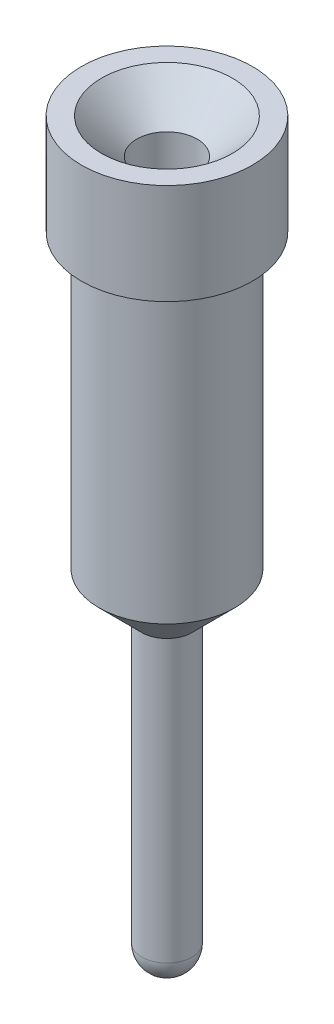
ISO-10303-21;
HEADER;
FILE_DESCRIPTION(('STEP AP214'),'2;1');
FILE_NAME('part.step','',(''),(''),'','','');
FILE_SCHEMA(('AUTOMOTIVE_DESIGN { 1 0 10303 214 1 1 1 1 }'));
ENDSEC;
DATA;
#1=APPLICATION_CONTEXT('core data for automotive mechanical design processes');
#2=APPLICATION_PROTOCOL_DEFINITION('international standard','automotive_design',2000,#1);
#3=PRODUCT_CONTEXT('',#1,'mechanical');
#4=PRODUCT('Part','Part','',(#3));
#5=PRODUCT_RELATED_PRODUCT_CATEGORY('part','',(#4));
#6=PRODUCT_DEFINITION_FORMATION('','',#4);
#7=PRODUCT_DEFINITION_CONTEXT('part definition',#1,'design');
#8=PRODUCT_DEFINITION('design','',#6,#7);
#9=PRODUCT_DEFINITION_SHAPE('','',#8);
#10=(LENGTH_UNIT() NAMED_UNIT(*) SI_UNIT(.MILLI.,.METRE.));
#11=(NAMED_UNIT(*) PLANE_ANGLE_UNIT() SI_UNIT($,.RADIAN.));
#12=(NAMED_UNIT(*) SI_UNIT($,.STERADIAN.) SOLID_ANGLE_UNIT());
#13=UNCERTAINTY_MEASURE_WITH_UNIT(LENGTH_MEASURE(1.E-05),#10,'distance_accuracy_value','');
#14=(GEOMETRIC_REPRESENTATION_CONTEXT(3) GLOBAL_UNCERTAINTY_ASSIGNED_CONTEXT((#13)) GLOBAL_UNIT_ASSIGNED_CONTEXT((#10,
#11,#12)) REPRESENTATION_CONTEXT('',''));
#15=CARTESIAN_POINT('',(0.,0.,0.));
#16=DIRECTION('',(0.,0.,1.));
#17=DIRECTION('',(1.,0.,0.));
#18=AXIS2_PLACEMENT_3D('',#15,#16,#17);
#19=CARTESIAN_POINT('',(-0.849999999999997,0.,0.));
#20=DIRECTION('',(0.,1.,0.));
#21=DIRECTION('',(0.,0.,1.));
#22=AXIS2_PLACEMENT_3D('',#19,#20,#21);
#23=PLANE('',#22);
#24=CARTESIAN_POINT('',(0.,0.,0.));
#25=DIRECTION('',(0.,1.,0.));
#26=DIRECTION('',(0.,0.,1.));
#27=AXIS2_PLACEMENT_3D('',#24,#25,#26);
#28=CIRCLE('',#27,0.849999999999997);
#29=CARTESIAN_POINT('',(0.,0.,0.849999999999997));
#30=VERTEX_POINT('',#29);
#31=EDGE_CURVE('E11',#30,#30,#28,.T.);
#32=ORIENTED_EDGE('',*,*,#31,.T.);
#33=EDGE_LOOP('',(#32));
#34=FACE_BOUND('',#33,.T.);
#35=CARTESIAN_POINT('',(0.,0.,0.));
#36=DIRECTION('',(0.,1.,0.));
#37=DIRECTION('',(0.,0.,1.));
#38=AXIS2_PLACEMENT_3D('',#35,#36,#37);
#39=CIRCLE('',#38,0.649999999999995);
#40=CARTESIAN_POINT('',(0.,0.,0.649999999999995));
#41=VERTEX_POINT('',#40);
#42=EDGE_CURVE('E77',#41,#41,#39,.T.);
#43=ORIENTED_EDGE('',*,*,#42,.F.);
#44=EDGE_LOOP('',(#43));
#45=FACE_BOUND('',#44,.T.);
#46=ADVANCED_FACE('F39',(#34,#45),#23,.T.);
#47=CARTESIAN_POINT('',(0.,28.992562867327,0.));
#48=DIRECTION('',(0.,1.,0.));
#49=DIRECTION('',(0.,0.,1.));
#50=AXIS2_PLACEMENT_3D('',#47,#48,#49);
#51=CYLINDRICAL_SURFACE('',#50,0.849999999999996);
#52=CARTESIAN_POINT('',(0.,-1.,0.));
#53=DIRECTION('',(0.,1.,0.));
#54=DIRECTION('',(0.,0.,1.));
#55=AXIS2_PLACEMENT_3D('',#52,#53,#54);
#56=CIRCLE('',#55,0.849999999999996);
#57=CARTESIAN_POINT('',(0.,-1.,0.849999999999996));
#58=VERTEX_POINT('',#57);
#59=EDGE_CURVE('E45',#58,#58,#56,.T.);
#60=ORIENTED_EDGE('',*,*,#59,.T.);
#61=EDGE_LOOP('',(#60));
#62=FACE_BOUND('',#61,.T.);
#63=ORIENTED_EDGE('',*,*,#31,.F.);
#64=EDGE_LOOP('',(#63));
#65=FACE_BOUND('',#64,.T.);
#66=ADVANCED_FACE('F66',(#62,#65),#51,.T.);
#67=CARTESIAN_POINT('',(-0.849999999999996,-0.999999999999999,0.));
#68=DIRECTION('',(0.,-1.,0.));
#69=DIRECTION('',(0.,0.,-1.));
#70=AXIS2_PLACEMENT_3D('',#67,#68,#69);
#71=PLANE('',#70);
#72=CARTESIAN_POINT('',(0.,-1.,0.));
#73=DIRECTION('',(0.,1.,0.));
#74=DIRECTION('',(0.,0.,1.));
#75=AXIS2_PLACEMENT_3D('',#72,#73,#74);
#76=CIRCLE('',#75,0.674999999999996);
#77=CARTESIAN_POINT('',(0.,-1.,0.674999999999996));
#78=VERTEX_POINT('',#77);
#79=EDGE_CURVE('E95',#78,#78,#76,.T.);
#80=ORIENTED_EDGE('',*,*,#79,.T.);
#81=EDGE_LOOP('',(#80));
#82=FACE_BOUND('',#81,.T.);
#83=ORIENTED_EDGE('',*,*,#59,.F.);
#84=EDGE_LOOP('',(#83));
#85=FACE_BOUND('',#84,.T.);
#86=ADVANCED_FACE('F71',(#82,#85),#71,.T.);
#87=CARTESIAN_POINT('',(0.,28.992562867327,0.));
#88=DIRECTION('',(0.,1.,0.));
#89=DIRECTION('',(0.,0.,1.));
#90=AXIS2_PLACEMENT_3D('',#87,#88,#89);
#91=CYLINDRICAL_SURFACE('',#90,0.674999999999996);
#92=CARTESIAN_POINT('',(0.,-3.9,0.));
#93=DIRECTION('',(0.,1.,0.));
#94=DIRECTION('',(0.,0.,1.));
#95=AXIS2_PLACEMENT_3D('',#92,#93,#94);
#96=CIRCLE('',#95,0.674999999999995);
#97=CARTESIAN_POINT('',(0.,-3.9,0.674999999999995));
#98=VERTEX_POINT('',#97);
#99=EDGE_CURVE('E92',#98,#98,#96,.T.);
#100=ORIENTED_EDGE('',*,*,#99,.T.);
#101=EDGE_LOOP('',(#100));
#102=FACE_BOUND('',#101,.T.);
#103=ORIENTED_EDGE('',*,*,#79,.F.);
#104=EDGE_LOOP('',(#103));
#105=FACE_BOUND('',#104,.T.);
#106=ADVANCED_FACE('F102',(#102,#105),#91,.T.);
#107=CARTESIAN_POINT('',(0.,-3.9,0.));
#108=DIRECTION('',(0.,1.,0.));
#109=DIRECTION('',(0.,0.,1.));
#110=AXIS2_PLACEMENT_3D('',#107,#108,#109);
#111=CONICAL_SURFACE('',#110,0.674999999999995,0.785398163397453);
#112=CARTESIAN_POINT('',(0.,-4.325,0.));
#113=DIRECTION('',(0.,1.,0.));
#114=DIRECTION('',(0.,0.,1.));
#115=AXIS2_PLACEMENT_3D('',#112,#113,#114);
#116=CIRCLE('',#115,0.249999999999996);
#117=CARTESIAN_POINT('',(0.,-4.325,0.249999999999996));
#118=VERTEX_POINT('',#117);
#119=EDGE_CURVE('E89',#118,#118,#116,.T.);
#120=ORIENTED_EDGE('',*,*,#119,.T.);
#121=EDGE_LOOP('',(#120));
#122=FACE_BOUND('',#121,.T.);
#123=ORIENTED_EDGE('',*,*,#99,.F.);
#124=EDGE_LOOP('',(#123));
#125=FACE_BOUND('',#124,.T.);
#126=ADVANCED_FACE('F108',(#122,#125),#111,.T.);
#127=CARTESIAN_POINT('',(0.,28.992562867327,0.));
#128=DIRECTION('',(0.,1.,0.));
#129=DIRECTION('',(0.,0.,1.));
#130=AXIS2_PLACEMENT_3D('',#127,#128,#129);
#131=CYLINDRICAL_SURFACE('',#130,0.249999999999996);
#132=CARTESIAN_POINT('',(0.,-7.12,0.));
#133=DIRECTION('',(0.,1.,0.));
#134=DIRECTION('',(0.,0.,1.));
#135=AXIS2_PLACEMENT_3D('',#132,#133,#134);
#136=CIRCLE('',#135,0.249999999999996);
#137=CARTESIAN_POINT('',(0.,-7.12,0.249999999999996));
#138=VERTEX_POINT('',#137);
#139=EDGE_CURVE('E86',#138,#138,#136,.T.);
#140=ORIENTED_EDGE('',*,*,#139,.T.);
#141=EDGE_LOOP('',(#140));
#142=FACE_BOUND('',#141,.T.);
#143=ORIENTED_EDGE('',*,*,#119,.F.);
#144=EDGE_LOOP('',(#143));
#145=FACE_BOUND('',#144,.T.);
#146=ADVANCED_FACE('F61',(#142,#145),#131,.T.);
#147=CARTESIAN_POINT('',(0.,-7.12,0.));
#148=DIRECTION('',(0.,1.,0.));
#149=DIRECTION('',(-1.,0.,0.));
#150=AXIS2_PLACEMENT_3D('',#147,#148,#149);
#151=SPHERICAL_SURFACE('',#150,0.249999999999996);
#152=ORIENTED_EDGE('',*,*,#139,.F.);
#153=EDGE_LOOP('',(#152));
#154=FACE_BOUND('',#153,.T.);
#155=ADVANCED_FACE('F51',(#154),#151,.T.);
#156=CARTESIAN_POINT('',(0.,-4.,0.));
#157=DIRECTION('',(0.,1.,0.));
#158=DIRECTION('',(0.,0.,1.));
#159=AXIS2_PLACEMENT_3D('',#156,#157,#158);
#160=CONICAL_SURFACE('',#159,0.,0.785398163397442);
#161=CARTESIAN_POINT('',(0.,-3.7,0.));
#162=DIRECTION('',(0.,1.,0.));
#163=DIRECTION('',(0.,0.,1.));
#164=AXIS2_PLACEMENT_3D('',#161,#162,#163);
#165=CIRCLE('',#164,0.299999999999995);
#166=CARTESIAN_POINT('',(0.,-3.7,0.299999999999995));
#167=VERTEX_POINT('',#166);
#168=EDGE_CURVE('E82',#167,#167,#165,.T.);
#169=ORIENTED_EDGE('',*,*,#168,.T.);
#170=EDGE_LOOP('',(#169));
#171=FACE_BOUND('',#170,.T.);
#172=CARTESIAN_POINT('',(0.,-4.,0.));
#173=VERTEX_POINT('',#172);
#174=VERTEX_LOOP('',#173);
#175=FACE_BOUND('',#174,.T.);
#176=ADVANCED_FACE('F48',(#171,#175),#160,.F.);
#177=CARTESIAN_POINT('',(0.,28.992562867327,0.));
#178=DIRECTION('',(0.,1.,0.));
#179=DIRECTION('',(0.,0.,1.));
#180=AXIS2_PLACEMENT_3D('',#177,#178,#179);
#181=CYLINDRICAL_SURFACE('',#180,0.299999999999996);
#182=CARTESIAN_POINT('',(0.,-0.35,0.));
#183=DIRECTION('',(0.,1.,0.));
#184=DIRECTION('',(0.,0.,1.));
#185=AXIS2_PLACEMENT_3D('',#182,#183,#184);
#186=CIRCLE('',#185,0.299999999999996);
#187=CARTESIAN_POINT('',(0.,-0.35,0.299999999999996));
#188=VERTEX_POINT('',#187);
#189=EDGE_CURVE('E79',#188,#188,#186,.T.);
#190=ORIENTED_EDGE('',*,*,#189,.T.);
#191=EDGE_LOOP('',(#190));
#192=FACE_BOUND('',#191,.T.);
#193=ORIENTED_EDGE('',*,*,#168,.F.);
#194=EDGE_LOOP('',(#193));
#195=FACE_BOUND('',#194,.T.);
#196=ADVANCED_FACE('F50',(#192,#195),#181,.F.);
#197=CARTESIAN_POINT('',(0.,-0.35,0.));
#198=DIRECTION('',(0.,1.,0.));
#199=DIRECTION('',(0.,0.,1.));
#200=AXIS2_PLACEMENT_3D('',#197,#198,#199);
#201=CONICAL_SURFACE('',#200,0.299999999999996,0.785398163397447);
#202=ORIENTED_EDGE('',*,*,#42,.T.);
#203=EDGE_LOOP('',(#202));
#204=FACE_BOUND('',#203,.T.);
#205=ORIENTED_EDGE('',*,*,#189,.F.);
#206=EDGE_LOOP('',(#205));
#207=FACE_BOUND('',#206,.T.);
#208=ADVANCED_FACE('F58',(#204,#207),#201,.F.);
#209=CLOSED_SHELL('',(#46,#66,#86,#106,#126,#146,#155,#176,#196,#208));
#210=MANIFOLD_SOLID_BREP('B2',#209);
#211=ADVANCED_BREP_SHAPE_REPRESENTATION('',(#18,#210),#14);
#212=SHAPE_DEFINITION_REPRESENTATION(#9,#211);
ENDSEC;
END-ISO-10303-21;
